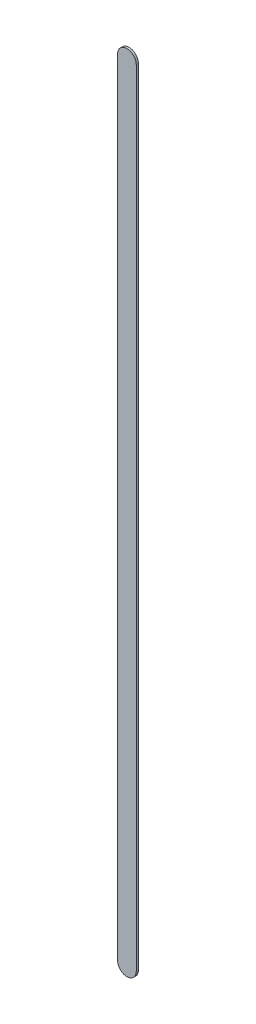
ISO-10303-21;
HEADER;
FILE_DESCRIPTION(('STEP AP214'),'2;1');
FILE_NAME('part.step','',(''),(''),'','','');
FILE_SCHEMA(('AUTOMOTIVE_DESIGN { 1 0 10303 214 1 1 1 1 }'));
ENDSEC;
DATA;
#1=APPLICATION_CONTEXT('core data for automotive mechanical design processes');
#2=APPLICATION_PROTOCOL_DEFINITION('international standard','automotive_design',2000,#1);
#3=PRODUCT_CONTEXT('',#1,'mechanical');
#4=PRODUCT('Part','Part','',(#3));
#5=PRODUCT_RELATED_PRODUCT_CATEGORY('part','',(#4));
#6=PRODUCT_DEFINITION_FORMATION('','',#4);
#7=PRODUCT_DEFINITION_CONTEXT('part definition',#1,'design');
#8=PRODUCT_DEFINITION('design','',#6,#7);
#9=PRODUCT_DEFINITION_SHAPE('','',#8);
#10=(LENGTH_UNIT() NAMED_UNIT(*) SI_UNIT(.MILLI.,.METRE.));
#11=(NAMED_UNIT(*) PLANE_ANGLE_UNIT() SI_UNIT($,.RADIAN.));
#12=(NAMED_UNIT(*) SI_UNIT($,.STERADIAN.) SOLID_ANGLE_UNIT());
#13=UNCERTAINTY_MEASURE_WITH_UNIT(LENGTH_MEASURE(1.E-05),#10,'distance_accuracy_value','');
#14=(GEOMETRIC_REPRESENTATION_CONTEXT(3) GLOBAL_UNCERTAINTY_ASSIGNED_CONTEXT((#13)) GLOBAL_UNIT_ASSIGNED_CONTEXT((#10,
#11,#12)) REPRESENTATION_CONTEXT('',''));
#15=CARTESIAN_POINT('',(0.,0.,0.));
#16=DIRECTION('',(0.,0.,1.));
#17=DIRECTION('',(1.,0.,0.));
#18=AXIS2_PLACEMENT_3D('',#15,#16,#17);
#19=CARTESIAN_POINT('',(76.71,-93.33,1.635));
#20=DIRECTION('',(0.,0.,1.));
#21=DIRECTION('',(1.,0.,0.));
#22=AXIS2_PLACEMENT_3D('',#19,#20,#21);
#23=PLANE('',#22);
#24=DIRECTION('',(0.,-1.,0.));
#25=VECTOR('',#24,1.);
#26=CARTESIAN_POINT('',(76.71,-93.33,1.635));
#27=LINE('',#26,#25);
#28=CARTESIAN_POINT('',(76.71,-93.33,1.635));
#29=VERTEX_POINT('',#28);
#30=CARTESIAN_POINT('',(76.71,-105.93,1.635));
#31=VERTEX_POINT('',#30);
#32=EDGE_CURVE('E81',#29,#31,#27,.T.);
#33=ORIENTED_EDGE('',*,*,#32,.T.);
#34=CARTESIAN_POINT('',(76.86,-105.93,1.635));
#35=DIRECTION('',(0.,0.,1.));
#36=DIRECTION('',(-1.,0.,0.));
#37=AXIS2_PLACEMENT_3D('',#34,#35,#36);
#38=CIRCLE('',#37,0.15);
#39=CARTESIAN_POINT('',(77.01,-105.93,1.635));
#40=VERTEX_POINT('',#39);
#41=EDGE_CURVE('E99',#31,#40,#38,.T.);
#42=ORIENTED_EDGE('',*,*,#41,.T.);
#43=DIRECTION('',(0.,1.,0.));
#44=VECTOR('',#43,1.);
#45=CARTESIAN_POINT('',(77.01,-105.93,1.635));
#46=LINE('',#45,#44);
#47=CARTESIAN_POINT('',(77.01,-93.33,1.635));
#48=VERTEX_POINT('',#47);
#49=EDGE_CURVE('E74',#40,#48,#46,.T.);
#50=ORIENTED_EDGE('',*,*,#49,.T.);
#51=CARTESIAN_POINT('',(76.86,-93.33,1.635));
#52=DIRECTION('',(0.,0.,1.));
#53=DIRECTION('',(1.,0.,0.));
#54=AXIS2_PLACEMENT_3D('',#51,#52,#53);
#55=CIRCLE('',#54,0.15);
#56=EDGE_CURVE('E11',#48,#29,#55,.T.);
#57=ORIENTED_EDGE('',*,*,#56,.T.);
#58=EDGE_LOOP('',(#33,#42,#50,#57));
#59=FACE_BOUND('',#58,.T.);
#60=ADVANCED_FACE('F17',(#59),#23,.T.);
#61=CARTESIAN_POINT('',(76.71,-93.33,1.6));
#62=DIRECTION('',(0.,0.,1.));
#63=DIRECTION('',(1.,0.,0.));
#64=AXIS2_PLACEMENT_3D('',#61,#62,#63);
#65=PLANE('',#64);
#66=CARTESIAN_POINT('',(76.86,-93.33,1.6));
#67=DIRECTION('',(0.,0.,1.));
#68=DIRECTION('',(1.,0.,0.));
#69=AXIS2_PLACEMENT_3D('',#66,#67,#68);
#70=CIRCLE('',#69,0.15);
#71=CARTESIAN_POINT('',(77.01,-93.33,1.6));
#72=VERTEX_POINT('',#71);
#73=CARTESIAN_POINT('',(76.71,-93.33,1.6));
#74=VERTEX_POINT('',#73);
#75=EDGE_CURVE('E25',#72,#74,#70,.T.);
#76=ORIENTED_EDGE('',*,*,#75,.F.);
#77=DIRECTION('',(0.,1.,0.));
#78=VECTOR('',#77,1.);
#79=CARTESIAN_POINT('',(77.01,-105.93,1.6));
#80=LINE('',#79,#78);
#81=CARTESIAN_POINT('',(77.01,-105.93,1.6));
#82=VERTEX_POINT('',#81);
#83=EDGE_CURVE('E97',#82,#72,#80,.T.);
#84=ORIENTED_EDGE('',*,*,#83,.F.);
#85=CARTESIAN_POINT('',(76.86,-105.93,1.6));
#86=DIRECTION('',(0.,0.,1.));
#87=DIRECTION('',(-1.,0.,0.));
#88=AXIS2_PLACEMENT_3D('',#85,#86,#87);
#89=CIRCLE('',#88,0.15);
#90=CARTESIAN_POINT('',(76.71,-105.93,1.6));
#91=VERTEX_POINT('',#90);
#92=EDGE_CURVE('E83',#91,#82,#89,.T.);
#93=ORIENTED_EDGE('',*,*,#92,.F.);
#94=DIRECTION('',(0.,-1.,0.));
#95=VECTOR('',#94,1.);
#96=CARTESIAN_POINT('',(76.71,-93.33,1.6));
#97=LINE('',#96,#95);
#98=EDGE_CURVE('E79',#74,#91,#97,.T.);
#99=ORIENTED_EDGE('',*,*,#98,.F.);
#100=EDGE_LOOP('',(#76,#84,#93,#99));
#101=FACE_BOUND('',#100,.T.);
#102=ADVANCED_FACE('F85',(#101),#65,.F.);
#103=CARTESIAN_POINT('',(76.86,-93.33,1.6));
#104=DIRECTION('',(0.,0.,-1.));
#105=DIRECTION('',(1.,0.,0.));
#106=AXIS2_PLACEMENT_3D('',#103,#104,#105);
#107=CYLINDRICAL_SURFACE('',#106,0.15);
#108=ORIENTED_EDGE('',*,*,#75,.T.);
#109=DIRECTION('',(0.,0.,1.));
#110=VECTOR('',#109,1.);
#111=CARTESIAN_POINT('',(76.71,-93.33,1.6));
#112=LINE('',#111,#110);
#113=EDGE_CURVE('E68',#74,#29,#112,.T.);
#114=ORIENTED_EDGE('',*,*,#113,.T.);
#115=ORIENTED_EDGE('',*,*,#56,.F.);
#116=DIRECTION('',(0.,0.,1.));
#117=VECTOR('',#116,1.);
#118=CARTESIAN_POINT('',(77.01,-93.33,1.6));
#119=LINE('',#118,#117);
#120=EDGE_CURVE('E71',#72,#48,#119,.T.);
#121=ORIENTED_EDGE('',*,*,#120,.F.);
#122=EDGE_LOOP('',(#108,#114,#115,#121));
#123=FACE_BOUND('',#122,.T.);
#124=ADVANCED_FACE('F67',(#123),#107,.T.);
#125=CARTESIAN_POINT('',(77.01,-105.93,1.6));
#126=DIRECTION('',(-1.,0.,0.));
#127=DIRECTION('',(0.,0.,1.));
#128=AXIS2_PLACEMENT_3D('',#125,#126,#127);
#129=PLANE('',#128);
#130=ORIENTED_EDGE('',*,*,#83,.T.);
#131=ORIENTED_EDGE('',*,*,#120,.T.);
#132=ORIENTED_EDGE('',*,*,#49,.F.);
#133=DIRECTION('',(0.,0.,1.));
#134=VECTOR('',#133,1.);
#135=CARTESIAN_POINT('',(77.01,-105.93,1.6));
#136=LINE('',#135,#134);
#137=EDGE_CURVE('E107',#82,#40,#136,.T.);
#138=ORIENTED_EDGE('',*,*,#137,.F.);
#139=EDGE_LOOP('',(#130,#131,#132,#138));
#140=FACE_BOUND('',#139,.T.);
#141=ADVANCED_FACE('F120',(#140),#129,.F.);
#142=CARTESIAN_POINT('',(76.86,-105.93,1.6));
#143=DIRECTION('',(0.,0.,-1.));
#144=DIRECTION('',(-1.,0.,0.));
#145=AXIS2_PLACEMENT_3D('',#142,#143,#144);
#146=CYLINDRICAL_SURFACE('',#145,0.15);
#147=ORIENTED_EDGE('',*,*,#92,.T.);
#148=ORIENTED_EDGE('',*,*,#137,.T.);
#149=ORIENTED_EDGE('',*,*,#41,.F.);
#150=DIRECTION('',(0.,0.,1.));
#151=VECTOR('',#150,1.);
#152=CARTESIAN_POINT('',(76.71,-105.93,1.6));
#153=LINE('',#152,#151);
#154=EDGE_CURVE('E89',#91,#31,#153,.T.);
#155=ORIENTED_EDGE('',*,*,#154,.F.);
#156=EDGE_LOOP('',(#147,#148,#149,#155));
#157=FACE_BOUND('',#156,.T.);
#158=ADVANCED_FACE('F122',(#157),#146,.T.);
#159=CARTESIAN_POINT('',(76.71,-93.33,1.6));
#160=DIRECTION('',(1.,0.,0.));
#161=DIRECTION('',(0.,1.,0.));
#162=AXIS2_PLACEMENT_3D('',#159,#160,#161);
#163=PLANE('',#162);
#164=ORIENTED_EDGE('',*,*,#98,.T.);
#165=ORIENTED_EDGE('',*,*,#154,.T.);
#166=ORIENTED_EDGE('',*,*,#32,.F.);
#167=ORIENTED_EDGE('',*,*,#113,.F.);
#168=EDGE_LOOP('',(#164,#165,#166,#167));
#169=FACE_BOUND('',#168,.T.);
#170=ADVANCED_FACE('F77',(#169),#163,.F.);
#171=CLOSED_SHELL('',(#60,#102,#124,#141,#158,#170));
#172=MANIFOLD_SOLID_BREP('B1',#171);
#173=ADVANCED_BREP_SHAPE_REPRESENTATION('',(#18,#172),#14);
#174=SHAPE_DEFINITION_REPRESENTATION(#9,#173);
ENDSEC;
END-ISO-10303-21;
